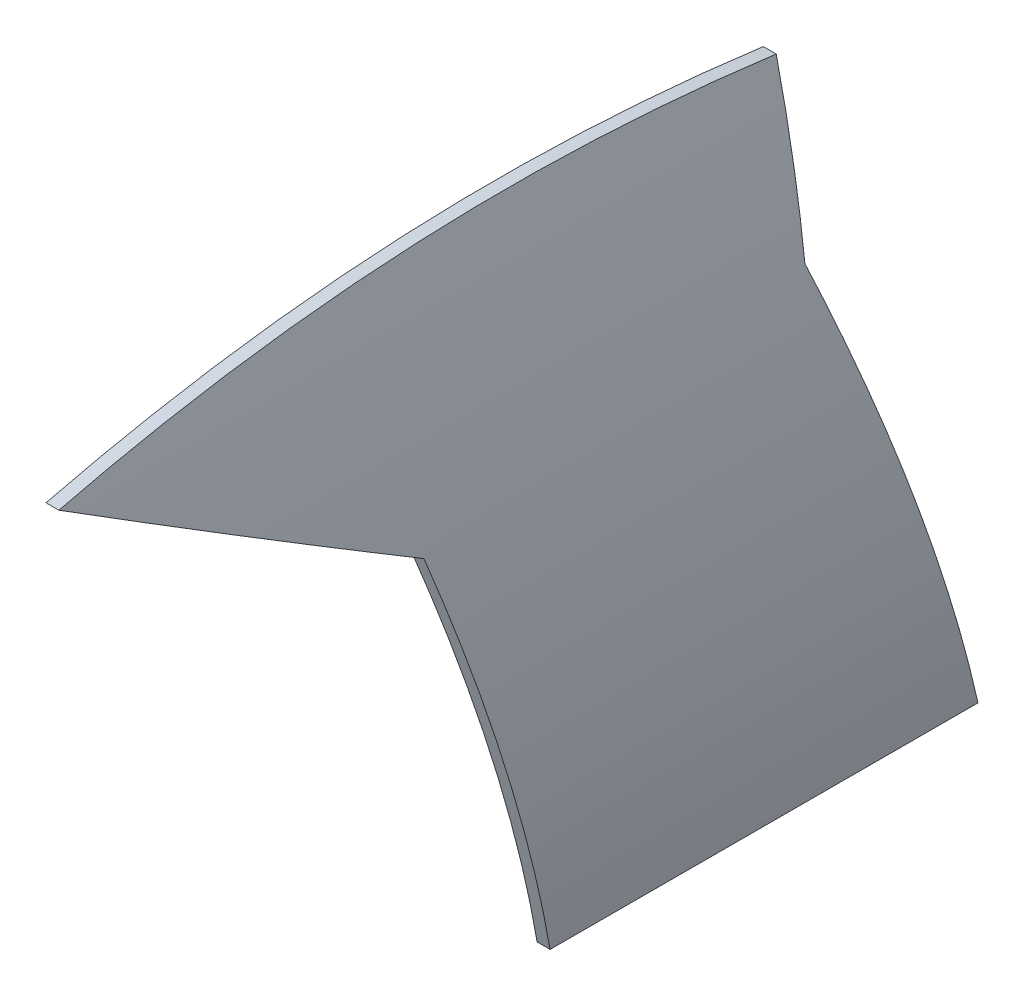
ISO-10303-21;
HEADER;
FILE_DESCRIPTION(('STEP AP214'),'2;1');
FILE_NAME('part.step','',(''),(''),'','','');
FILE_SCHEMA(('AUTOMOTIVE_DESIGN { 1 0 10303 214 1 1 1 1 }'));
ENDSEC;
DATA;
#1=APPLICATION_CONTEXT('core data for automotive mechanical design processes');
#2=APPLICATION_PROTOCOL_DEFINITION('international standard','automotive_design',2000,#1);
#3=PRODUCT_CONTEXT('',#1,'mechanical');
#4=PRODUCT('Part','Part','',(#3));
#5=PRODUCT_RELATED_PRODUCT_CATEGORY('part','',(#4));
#6=PRODUCT_DEFINITION_FORMATION('','',#4);
#7=PRODUCT_DEFINITION_CONTEXT('part definition',#1,'design');
#8=PRODUCT_DEFINITION('design','',#6,#7);
#9=PRODUCT_DEFINITION_SHAPE('','',#8);
#10=(LENGTH_UNIT() NAMED_UNIT(*) SI_UNIT(.MILLI.,.METRE.));
#11=(NAMED_UNIT(*) PLANE_ANGLE_UNIT() SI_UNIT($,.RADIAN.));
#12=(NAMED_UNIT(*) SI_UNIT($,.STERADIAN.) SOLID_ANGLE_UNIT());
#13=UNCERTAINTY_MEASURE_WITH_UNIT(LENGTH_MEASURE(1.E-05),#10,'distance_accuracy_value','');
#14=(GEOMETRIC_REPRESENTATION_CONTEXT(3) GLOBAL_UNCERTAINTY_ASSIGNED_CONTEXT((#13)) GLOBAL_UNIT_ASSIGNED_CONTEXT((#10,
#11,#12)) REPRESENTATION_CONTEXT('',''));
#15=CARTESIAN_POINT('',(0.,0.,0.));
#16=DIRECTION('',(0.,0.,1.));
#17=DIRECTION('',(1.,0.,0.));
#18=AXIS2_PLACEMENT_3D('',#15,#16,#17);
#19=CARTESIAN_POINT('',(424.408763923994,535.98584495263,-1500.));
#20=CARTESIAN_POINT('',(580.279022027442,-69.3133814321735,-1500.));
#21=CARTESIAN_POINT('',(402.972403467795,-683.224116143835,-1500.));
#22=B_SPLINE_CURVE_WITH_KNOTS('',2,(#19,#20,#21),.UNSPECIFIED.,.F.,.F.,(3,3),(0.,1.),.UNSPECIFIED.);
#23=DIRECTION('',(0.,0.,1.));
#24=VECTOR('',#23,1.);
#25=SURFACE_OF_LINEAR_EXTRUSION('',#22,#24);
#26=CARTESIAN_POINT('',(424.408763923994,535.98584495263,-428.349120030013));
#27=CARTESIAN_POINT('',(580.279022027442,-69.3133814321735,-428.349120030013));
#28=CARTESIAN_POINT('',(402.972403467795,-683.224116143835,-428.349120030013));
#29=B_SPLINE_CURVE_WITH_KNOTS('',2,(#26,#27,#28),.UNSPECIFIED.,.F.,.F.,(3,3),(0.,1.),.UNSPECIFIED.);
#30=CARTESIAN_POINT('',(483.593842745896,214.831415583255,-428.349120030013));
#31=VERTEX_POINT('',#30);
#32=CARTESIAN_POINT('',(438.003436023907,480.454128250413,-428.349120030013));
#33=VERTEX_POINT('',#32);
#34=EDGE_CURVE('E118',#31,#33,#29,.F.);
#35=ORIENTED_EDGE('',*,*,#34,.T.);
#36=CARTESIAN_POINT('',(438.003436023766,480.454128251022,-428.349120030013));
#37=CARTESIAN_POINT('',(437.692195512989,481.794967451917,-416.288473386201));
#38=CARTESIAN_POINT('',(437.392825184706,483.079434502654,-404.221246889934));
#39=CARTESIAN_POINT('',(436.818516031521,485.535053758608,-380.074614450257));
#40=CARTESIAN_POINT('',(436.543577358049,486.706205261494,-367.995208431827));
#41=CARTESIAN_POINT('',(436.018825870421,488.934609034484,-343.825316440315));
#42=CARTESIAN_POINT('',(435.769013119235,489.991861019138,-331.734830439541));
#43=CARTESIAN_POINT('',(435.295133177661,491.991931494098,-307.543889107207));
#44=CARTESIAN_POINT('',(435.071065992102,492.93474996294,-295.443433773777));
#45=CARTESIAN_POINT('',(434.649259451483,494.705377358875,-271.234763089152));
#46=CARTESIAN_POINT('',(434.451517692892,495.533196785769,-259.126548547946));
#47=CARTESIAN_POINT('',(434.08283838524,497.073472968752,-234.902388978163));
#48=CARTESIAN_POINT('',(433.911900804925,497.785929859358,-222.786443958616));
#49=CARTESIAN_POINT('',(433.597267430045,499.095068904542,-198.547946928205));
#50=CARTESIAN_POINT('',(433.453571633116,499.691751069166,-186.425394917915));
#51=CARTESIAN_POINT('',(433.19379548125,500.768970877602,-162.1748105472));
#52=CARTESIAN_POINT('',(433.077715181199,501.249508290579,-150.046778175931));
#53=CARTESIAN_POINT('',(432.873474212692,502.094131162167,-125.785793508346));
#54=CARTESIAN_POINT('',(432.785314991954,502.458210582407,-113.652840989565));
#55=CARTESIAN_POINT('',(432.637167760409,503.069599793639,-89.3838165546957));
#56=CARTESIAN_POINT('',(432.577179760872,503.316909537921,-77.2477446373603));
#57=CARTESIAN_POINT('',(432.485552128072,503.694519372388,-52.973719864869));
#58=CARTESIAN_POINT('',(432.453912384939,503.824819916066,-40.8357670171855));
#59=CARTESIAN_POINT('',(432.419090806649,503.968218748881,-16.5592199803324));
#60=CARTESIAN_POINT('',(432.415908755145,503.981317929036,-4.42062579674005));
#61=CARTESIAN_POINT('',(432.438045127301,503.890164845572,19.8570699568527));
#62=CARTESIAN_POINT('',(432.463365836146,503.785903172646,31.9961714894985));
#63=CARTESIAN_POINT('',(432.542485727767,503.459911340544,56.2727299398717));
#64=CARTESIAN_POINT('',(432.596284972401,503.23818092622,68.4101868539695));
#65=CARTESIAN_POINT('',(432.732269481582,502.677191536173,92.6824190947496));
#66=CARTESIAN_POINT('',(432.814455189939,502.337930722913,104.817194376537));
#67=CARTESIAN_POINT('',(433.007052276336,501.541862510793,129.083004647092));
#68=CARTESIAN_POINT('',(433.117464477937,501.085051682187,141.214039516383));
#69=CARTESIAN_POINT('',(433.404819016761,499.894242747243,169.227227563865));
#70=CARTESIAN_POINT('',(433.591775624244,499.11821441931,185.107510507668));
#71=CARTESIAN_POINT('',(434.013036640264,497.36474953956,216.857135051826));
#72=CARTESIAN_POINT('',(434.247343534613,496.387302413533,232.72647603384));
#73=CARTESIAN_POINT('',(434.762419359628,494.23131614054,264.451473166395));
#74=CARTESIAN_POINT('',(435.043190419632,493.052767777524,280.307128656275));
#75=CARTESIAN_POINT('',(435.650112422779,490.49503598336,312.001986555513));
#76=CARTESIAN_POINT('',(435.976265103558,489.115844869628,327.841188311461));
#77=CARTESIAN_POINT('',(436.67267330223,486.157423714589,359.500396147693));
#78=CARTESIAN_POINT('',(437.042930116786,484.578187791873,375.320401649787));
#79=CARTESIAN_POINT('',(437.82607820568,481.220411713878,406.938486226524));
#80=CARTESIAN_POINT('',(438.238970276914,479.441867833283,422.736564885737));
#81=CARTESIAN_POINT('',(439.106069121052,475.684891825077,454.320322415401));
#82=CARTESIAN_POINT('',(439.560307916758,473.706304631452,470.105981958231));
#83=CARTESIAN_POINT('',(440.507983950036,469.551402715587,501.649906067918));
#84=CARTESIAN_POINT('',(441.001420776349,467.375090067813,517.408170920422));
#85=CARTESIAN_POINT('',(442.025472745004,462.825878226712,548.894655639282));
#86=CARTESIAN_POINT('',(442.556086898964,460.452984259315,564.62287629297));
#87=CARTESIAN_POINT('',(443.652298192155,455.511883474365,596.046650496786));
#88=CARTESIAN_POINT('',(444.217893744178,452.943685517109,611.742205495698));
#89=CARTESIAN_POINT('',(445.381716928357,447.613372632912,643.098046794105));
#90=CARTESIAN_POINT('',(445.979942366981,444.85127073751,658.758335390852));
#91=CARTESIAN_POINT('',(447.206474944181,439.134698709008,690.041088512163));
#92=CARTESIAN_POINT('',(447.834779300748,436.180246357396,705.663556394902));
#93=CARTESIAN_POINT('',(448.47688615743,433.130214411635,721.266753533404));
#94=B_SPLINE_CURVE_WITH_KNOTS('',3,(#36,#37,#38,#39,#40,#41,#42,#43,#44,#45,#46,#47,#48,#49,#50,
#51,#52,#53,#54,#55,#56,#57,#58,#59,#60,#61,#62,#63,#64,#65,#66,#67,#68,#69,#70,#71,#72,#73,#74,
#75,#76,#77,#78,#79,#80,#81,#82,#83,#84,#85,#86,#87,#88,#89,#90,#91,#92,#93),.UNSPECIFIED.,.F.,
.F.,(4,2,2,2,2,2,2,2,2,2,2,2,2,2,2,2,2,2,2,2,2,2,2,2,2,2,2,2,4),(0.,36.4166974903907,
72.8336206774067,109.250635128416,145.667656409643,182.081350504934,218.495002140053,
254.908650615213,291.322371461203,327.737980060536,364.153603227002,400.569085256438,
436.984290438651,473.402415387131,509.820619438127,546.239392897835,582.659229065064,
630.358815038332,678.060905812722,725.765183261944,773.471287782206,821.178795209432,
868.887194498413,916.632863277482,964.378031183775,1012.12193023657,1059.86366459667,
1107.60219348391,1155.3363155188),.UNSPECIFIED.);
#95=CARTESIAN_POINT('',(448.47688615743,433.130214411636,721.266753533404));
#96=VERTEX_POINT('',#95);
#97=EDGE_CURVE('E60',#33,#96,#94,.T.);
#98=ORIENTED_EDGE('',*,*,#97,.T.);
#99=CARTESIAN_POINT('',(448.47688615743,433.130214411636,721.266753533404));
#100=CARTESIAN_POINT('',(450.300676691619,424.466841645308,706.415257362557));
#101=CARTESIAN_POINT('',(452.073690968561,415.80075474374,691.55910838844));
#102=CARTESIAN_POINT('',(455.517721550087,398.464970406909,661.840620953873));
#103=CARTESIAN_POINT('',(457.188755671217,389.795273870279,646.978284033935));
#104=CARTESIAN_POINT('',(460.428792368563,372.452268668991,617.247417974585));
#105=CARTESIAN_POINT('',(461.997809226736,363.77896068176,602.378889996474));
#106=CARTESIAN_POINT('',(465.033781540913,346.428731362997,572.635639735737));
#107=CARTESIAN_POINT('',(466.500747728781,337.751810508238,557.760918270436));
#108=CARTESIAN_POINT('',(469.332587825648,320.39435410883,528.005278728594));
#109=CARTESIAN_POINT('',(470.697468903088,311.71381886111,513.124361161074));
#110=CARTESIAN_POINT('',(473.325108151083,294.349132336589,483.356327119038));
#111=CARTESIAN_POINT('',(474.587869914639,285.664981197826,468.469210881158));
#112=CARTESIAN_POINT('',(477.01124030841,268.293057931879,438.688770996679));
#113=CARTESIAN_POINT('',(478.171848903451,259.60528580345,423.795447347943));
#114=CARTESIAN_POINT('',(480.39088158466,242.226123370037,394.002597462093));
#115=CARTESIAN_POINT('',(481.449302090117,233.534732948976,379.103071025988));
#116=CARTESIAN_POINT('',(483.46392772598,216.148333133731,349.297814199852));
#117=CARTESIAN_POINT('',(484.42012568041,207.453323528437,334.39208344792));
#118=CARTESIAN_POINT('',(486.230275628958,190.059684529158,304.574416592014));
#119=CARTESIAN_POINT('',(487.084216845847,181.361054850418,289.662479999888));
#120=CARTESIAN_POINT('',(488.689821699354,163.960174858553,259.832400013834));
#121=CARTESIAN_POINT('',(489.441470952862,155.257924208485,244.914256042289));
#122=CARTESIAN_POINT('',(490.842464122613,137.849801438604,215.07175986535));
#123=CARTESIAN_POINT('',(491.491790047507,129.143928951179,200.147407029764));
#124=CARTESIAN_POINT('',(492.089879173517,120.437162941002,185.221522440889));
#125=B_SPLINE_CURVE_WITH_KNOTS('',3,(#99,#100,#101,#102,#103,#104,#105,#106,#107,#108,#109,#110,
#111,#112,#113,#114,#115,#116,#117,#118,#119,#120,#121,#122,#123,#124),.UNSPECIFIED.,.F.,.F.,(4,
2,2,2,2,2,2,2,2,2,2,2,4),(0.,51.8701924446341,103.731296758899,155.585125049739,
207.433492012824,259.278214746266,311.121112563406,362.964028231335,414.808759836801,
466.657128532731,518.51095692639,570.372068887664,622.242289357004),.UNSPECIFIED.);
#126=CARTESIAN_POINT('',(492.089879173517,120.437162941002,185.221522440889));
#127=VERTEX_POINT('',#126);
#128=EDGE_CURVE('E64',#96,#127,#125,.T.);
#129=ORIENTED_EDGE('',*,*,#128,.T.);
#130=CARTESIAN_POINT('',(492.089879173517,120.437162941002,185.221522440889));
#131=CARTESIAN_POINT('',(492.887576008317,108.825040924121,180.875068863687));
#132=CARTESIAN_POINT('',(493.59435741753,97.2074388762597,176.526564093755));
#133=CARTESIAN_POINT('',(494.82581759418,73.9639251989336,167.826444251517));
#134=CARTESIAN_POINT('',(495.35049874455,62.3380136802003,163.474829220657));
#135=CARTESIAN_POINT('',(496.217503518885,39.0803344067719,154.769407151508));
#136=CARTESIAN_POINT('',(496.559828819398,27.4485667069018,150.415600133739));
#137=CARTESIAN_POINT('',(497.062063272721,4.18163648381267,141.706715405208));
#138=CARTESIAN_POINT('',(497.221973340189,-7.45352602209167,137.351637700927));
#139=CARTESIAN_POINT('',(497.359461729347,-30.724782326233,128.641133706732));
#140=CARTESIAN_POINT('',(497.337040259262,-42.3608761233913,124.285707417222));
#141=CARTESIAN_POINT('',(497.110690767452,-65.571686089367,115.597828676393));
#142=CARTESIAN_POINT('',(496.907696459675,-77.1464102612246,111.265373229511));
#143=CARTESIAN_POINT('',(496.321874735935,-100.291874035615,102.601953772503));
#144=CARTESIAN_POINT('',(495.939047179457,-111.862613635027,98.2709897635453));
#145=CARTESIAN_POINT('',(494.994098840771,-134.997671477961,89.611465279216));
#146=CARTESIAN_POINT('',(494.431977988291,-146.561989718966,85.2829048047871));
#147=CARTESIAN_POINT('',(493.129131984398,-169.681776068601,76.6290964881473));
#148=CARTESIAN_POINT('',(492.388407140618,-181.237244192442,72.3038486402435));
#149=CARTESIAN_POINT('',(490.729190394887,-204.336904527487,63.6575735537906));
#150=CARTESIAN_POINT('',(489.810699580672,-215.881096807254,59.3365462895787));
#151=CARTESIAN_POINT('',(487.775423406808,-239.202266655656,50.6073594997082));
#152=CARTESIAN_POINT('',(486.654823250224,-250.97895228849,46.1993092465325));
#153=CARTESIAN_POINT('',(484.230377649556,-274.515771529412,37.3894042147957));
#154=CARTESIAN_POINT('',(482.926532042575,-286.275905122775,32.9875494417456));
#155=CARTESIAN_POINT('',(480.136909935596,-309.77732883883,24.1908930656336));
#156=CARTESIAN_POINT('',(478.651131867784,-321.518618798252,19.7960915236841));
#157=CARTESIAN_POINT('',(475.499096164043,-344.98007594195,11.0143947605641));
#158=CARTESIAN_POINT('',(473.832836250328,-356.700242857742,6.6274996398879));
#159=CARTESIAN_POINT('',(470.321422825258,-380.117189710088,-2.1375367820138));
#160=CARTESIAN_POINT('',(468.47626709174,-391.813969354293,-6.51567797381228));
#161=CARTESIAN_POINT('',(464.59856884961,-415.243591131398,-15.2854586596807));
#162=CARTESIAN_POINT('',(462.56508703401,-426.976296885453,-19.6770471067221));
#163=CARTESIAN_POINT('',(458.320949918418,-450.413527762545,-28.4496759025062));
#164=CARTESIAN_POINT('',(456.110295091986,-462.11805296082,-32.8307162794101));
#165=CARTESIAN_POINT('',(451.513816982361,-485.496692623682,-41.5814142005175));
#166=CARTESIAN_POINT('',(449.127996553405,-497.170807580582,-45.9510719289946));
#167=CARTESIAN_POINT('',(444.183310995153,-520.486412031024,-54.6781755730083));
#168=CARTESIAN_POINT('',(441.624451951714,-532.127902656999,-59.0356219124177));
#169=CARTESIAN_POINT('',(436.335957845644,-555.376088854112,-67.7374906934213));
#170=CARTESIAN_POINT('',(433.606332975203,-566.98278645863,-72.0819138961158));
#171=CARTESIAN_POINT('',(430.792344124756,-578.571491053465,-76.4196022590295));
#172=B_SPLINE_CURVE_WITH_KNOTS('',3,(#130,#131,#132,#133,#134,#135,#136,#137,#138,#139,#140,
#141,#142,#143,#144,#145,#146,#147,#148,#149,#150,#151,#152,#153,#154,#155,#156,#157,#158,#159,
#160,#161,#162,#163,#164,#165,#166,#167,#168,#169,#170,#171),.UNSPECIFIED.,.F.,.F.,(4,2,2,2,2,2,
2,2,2,2,2,2,2,2,2,2,2,2,2,2,4),(0.,37.2733090335321,74.5461302966621,111.818608873859,
149.090900560219,186.363149681013,223.443782954176,260.524445200686,297.605121980481,
334.685734891645,371.766120916679,409.638144551987,447.510201854108,485.382585543974,
523.255447261122,561.128779478246,599.202386261646,637.275891282729,675.34877605266,
713.420322475861,751.489598755791),.UNSPECIFIED.);
#173=CARTESIAN_POINT('',(430.792344124756,-578.571491053465,-76.4196022590295));
#174=VERTEX_POINT('',#173);
#175=EDGE_CURVE('E160',#127,#174,#172,.T.);
#176=ORIENTED_EDGE('',*,*,#175,.T.);
#177=CARTESIAN_POINT('',(430.792344124756,-578.571491053465,-76.4196022590295));
#178=CARTESIAN_POINT('',(430.754553586614,-578.727122930513,-189.715462215858));
#179=CARTESIAN_POINT('',(430.716747052109,-578.882754807554,-303.011322167346));
#180=CARTESIAN_POINT('',(430.641101990374,-579.194018561622,-529.603042059641));
#181=CARTESIAN_POINT('',(430.603263463145,-579.349650438648,-642.898902000449));
#182=CARTESIAN_POINT('',(430.565408939553,-579.505282315667,-756.194761935916));
#183=B_SPLINE_CURVE_WITH_KNOTS('',3,(#177,#178,#179,#180,#181,#182),.UNSPECIFIED.,.F.,.F.,(4,2,
4),(0.,339.88791946002,679.775838920041),.UNSPECIFIED.);
#184=CARTESIAN_POINT('',(430.565408939553,-579.505282315667,-756.194761935916));
#185=VERTEX_POINT('',#184);
#186=EDGE_CURVE('E165',#174,#185,#183,.T.);
#187=ORIENTED_EDGE('',*,*,#186,.T.);
#188=CARTESIAN_POINT('',(430.565408939553,-579.505282315667,-756.194761935916));
#189=CARTESIAN_POINT('',(433.695426795303,-566.636910787127,-750.883614238451));
#190=CARTESIAN_POINT('',(436.721299975674,-553.746858757861,-745.563518373671));
#191=CARTESIAN_POINT('',(442.562047225671,-527.925037200164,-734.906108630227));
#192=CARTESIAN_POINT('',(445.376906516925,-514.993264815876,-729.568793572869));
#193=CARTESIAN_POINT('',(450.792586179674,-489.09092727529,-718.878152563435));
#194=CARTESIAN_POINT('',(453.393397947963,-476.120360581427,-713.524825976762));
#195=CARTESIAN_POINT('',(458.378164110865,-450.143425250746,-702.803396310019));
#196=CARTESIAN_POINT('',(460.762114670433,-437.137055984972,-697.435292970363));
#197=CARTESIAN_POINT('',(465.310521878822,-411.091529027353,-686.6855535629));
#198=CARTESIAN_POINT('',(467.47497810238,-398.052371272031,-681.303917468895));
#199=CARTESIAN_POINT('',(471.568622699334,-372.029093215408,-670.563360823915));
#200=CARTESIAN_POINT('',(473.499249180951,-359.045166249448,-665.204520068007));
#201=CARTESIAN_POINT('',(477.139241999019,-333.051022958375,-654.47598818021));
#202=CARTESIAN_POINT('',(478.848611564833,-320.040807019778,-649.106297207848));
#203=CARTESIAN_POINT('',(482.044097002988,-293.997139360514,-638.357325186387));
#204=CARTESIAN_POINT('',(483.530215894804,-280.963687956521,-632.978044267988));
#205=CARTESIAN_POINT('',(486.277411860832,-254.876630007766,-622.211163823879));
#206=CARTESIAN_POINT('',(487.538490574806,-241.823023610563,-616.82356435907));
#207=CARTESIAN_POINT('',(489.834027498726,-215.698726137822,-606.041314090455));
#208=CARTESIAN_POINT('',(490.868484936728,-202.628035004241,-600.646663262693));
#209=CARTESIAN_POINT('',(492.57629236564,-178.364053903134,-590.632219160681));
#210=CARTESIAN_POINT('',(493.280229038835,-167.172594475257,-586.013181402888));
#211=CARTESIAN_POINT('',(494.52055271106,-144.781582730259,-576.771765718734));
#212=CARTESIAN_POINT('',(495.056937524328,-133.582030309473,-572.149387749589));
#213=CARTESIAN_POINT('',(495.961538930885,-111.177033056373,-562.902199843287));
#214=CARTESIAN_POINT('',(496.329754135983,-99.9715881761828,-558.277389886371));
#215=CARTESIAN_POINT('',(496.89753083575,-77.5569873796004,-549.026238320974));
#216=CARTESIAN_POINT('',(497.097091454502,-66.3478314442368,-544.399896704663));
#217=CARTESIAN_POINT('',(497.327203832937,-43.9279984331285,-535.146585653579));
#218=CARTESIAN_POINT('',(497.357755020837,-32.717321352366,-530.519616216734));
#219=CARTESIAN_POINT('',(497.249625313087,-10.2966381338409,-521.265954260552));
#220=CARTESIAN_POINT('',(497.110944021812,0.913368002291819,-516.639261741888));
#221=CARTESIAN_POINT('',(496.662761096108,23.4056407552212,-507.356052722197));
#222=CARTESIAN_POINT('',(496.352120533987,34.6878879968683,-502.699544217853));
#223=CARTESIAN_POINT('',(495.559281890108,57.2472275249121,-493.388654807723));
#224=CARTESIAN_POINT('',(495.077083846654,68.524319812459,-488.734273901462));
#225=CARTESIAN_POINT('',(493.941308019,91.0711374496482,-479.428552636473));
#226=CARTESIAN_POINT('',(493.287730081516,102.340862792692,-474.777212280467));
#227=CARTESIAN_POINT('',(491.809509084315,124.870741714975,-465.478482111163));
#228=CARTESIAN_POINT('',(490.984865733064,136.130895277869,-460.831092304611));
#229=CARTESIAN_POINT('',(489.164953089193,158.639431594048,-451.541170843775));
#230=CARTESIAN_POINT('',(488.169683505769,169.88781432724,-446.898639197786));
#231=CARTESIAN_POINT('',(486.009125554087,192.370624742577,-437.619335557451));
#232=CARTESIAN_POINT('',(484.843837118223,203.605052419171,-432.982563565397));
#233=CARTESIAN_POINT('',(483.593842745896,214.831415583255,-428.349120030013));
#234=B_SPLINE_CURVE_WITH_KNOTS('',3,(#188,#189,#190,#191,#192,#193,#194,#195,#196,#197,#198,
#199,#200,#201,#202,#203,#204,#205,#206,#207,#208,#209,#210,#211,#212,#213,#214,#215,#216,#217,
#218,#219,#220,#221,#222,#223,#224,#225,#226,#227,#228,#229,#230,#231,#232,#233),.UNSPECIFIED.,
.F.,.F.,(4,2,2,2,2,2,2,2,2,2,2,2,2,2,2,2,2,2,2,2,2,2,4),(0.,42.8062287043517,85.6154525503193,
128.426396186766,171.238096759198,214.04988027666,256.583321995697,299.11614284653,
341.648388387393,384.18032400317,426.712404493836,463.094221500134,499.476513097846,
535.859105015545,572.241885887128,608.624789846672,645.0077788605,681.634675330462,
718.2615636228,754.888484674606,791.515468147313,828.142514045073,864.769574507407),.UNSPECIFIED.);
#235=EDGE_CURVE('E196',#185,#31,#234,.T.);
#236=ORIENTED_EDGE('',*,*,#235,.T.);
#237=EDGE_LOOP('',(#35,#98,#129,#176,#187,#236));
#238=FACE_BOUND('',#237,.T.);
#239=ADVANCED_FACE('F41',(#238),#25,.F.);
#240=CARTESIAN_POINT('',(1500.,480.454128251022,-428.349120030013));
#241=DIRECTION('',(0.,0.,1.));
#242=DIRECTION('',(1.,0.,0.));
#243=AXIS2_PLACEMENT_3D('',#240,#241,#242);
#244=PLANE('',#243);
#245=ORIENTED_EDGE('',*,*,#34,.F.);
#246=DIRECTION('',(-1.,0.,0.));
#247=VECTOR('',#246,1.);
#248=CARTESIAN_POINT('',(1500.,214.831415583255,-428.349120030013));
#249=LINE('',#248,#247);
#250=CARTESIAN_POINT('',(463.469135644396,214.831415583255,-428.349120030013));
#251=VERTEX_POINT('',#250);
#252=EDGE_CURVE('E52',#31,#251,#249,.T.);
#253=ORIENTED_EDGE('',*,*,#252,.T.);
#254=CARTESIAN_POINT('',(405.040618853097,530.998364976459,-428.349120030013));
#255=CARTESIAN_POINT('',(406.64924054386,524.751519190664,-428.349120030013));
#256=CARTESIAN_POINT('',(409.817907630706,512.236240886698,-428.349120030013));
#257=CARTESIAN_POINT('',(415.934329316679,487.222740061786,-428.349120030013));
#258=CARTESIAN_POINT('',(423.17796267826,455.940151621809,-428.349120030013));
#259=CARTESIAN_POINT('',(431.223606194513,418.390634858821,-428.349120030013));
#260=CARTESIAN_POINT('',(441.090410068267,368.305125046003,-428.349120030013));
#261=CARTESIAN_POINT('',(451.809795678839,305.663556952693,-428.349120030013));
#262=CARTESIAN_POINT('',(462.091676613305,230.435403148491,-428.349120030013));
#263=CARTESIAN_POINT('',(469.792938408512,155.14701278781,-428.349120030013));
#264=CARTESIAN_POINT('',(476.621257213656,54.6790581344018,-428.349120030013));
#265=CARTESIAN_POINT('',(478.707620997031,-71.068183562901,-428.349120030013));
#266=CARTESIAN_POINT('',(472.195347161263,-197.047854413728,-428.349120030013));
#267=CARTESIAN_POINT('',(461.824335644245,-297.980275195886,-428.349120030013));
#268=CARTESIAN_POINT('',(451.46462833248,-373.756029871269,-428.349120030013));
#269=CARTESIAN_POINT('',(438.522460674971,-449.610285886943,-428.349120030013));
#270=CARTESIAN_POINT('',(425.584363343901,-512.88885754197,-428.349120030013));
#271=CARTESIAN_POINT('',(413.941312491673,-563.55304301742,-428.349120030013));
#272=CARTESIAN_POINT('',(404.562942079086,-601.570715398056,-428.349120030013));
#273=CARTESIAN_POINT('',(396.20780122886,-633.272967850054,-428.349120030013));
#274=CARTESIAN_POINT('',(389.202587350749,-658.637357812673,-428.349120030013));
#275=CARTESIAN_POINT('',(385.588019063241,-671.337435384699,-428.349120030013));
#276=CARTESIAN_POINT('',(383.757741212963,-677.674633786648,-428.349120030013));
#277=B_SPLINE_CURVE_WITH_KNOTS('',3,(#254,#255,#256,#257,#258,#259,#260,#261,#262,#263,#264,
#265,#266,#267,#268,#269,#270,#271,#272,#273,#274,#275,#276),.UNSPECIFIED.,.F.,.F.,(4,1,1,1,1,1,
1,1,1,1,1,1,1,1,1,1,1,1,1,1,4),(0.,0.015625,0.03125,0.0625,0.09375,0.125,0.1875,0.25,0.3125,
0.375,0.5,0.625,0.6875,0.75,0.8125,0.875,0.90625,0.9375,0.96875,0.984375,1.),.UNSPECIFIED.);
#278=CARTESIAN_POINT('',(417.46699620603,480.45412824548,-428.349120030013));
#279=VERTEX_POINT('',#278);
#280=EDGE_CURVE('E107',#251,#279,#277,.F.);
#281=ORIENTED_EDGE('',*,*,#280,.T.);
#282=DIRECTION('',(-1.,0.,0.));
#283=VECTOR('',#282,1.);
#284=CARTESIAN_POINT('',(1500.,480.454128251022,-428.349120030013));
#285=LINE('',#284,#283);
#286=EDGE_CURVE('E11',#33,#279,#285,.T.);
#287=ORIENTED_EDGE('',*,*,#286,.F.);
#288=EDGE_LOOP('',(#245,#253,#281,#287));
#289=FACE_BOUND('',#288,.T.);
#290=ADVANCED_FACE('F117',(#289),#244,.F.);
#291=CARTESIAN_POINT('',(1500.,214.831415583255,-428.349120030013));
#292=DIRECTION('',(0.,-0.381511665778787,0.924364024004989));
#293=DIRECTION('',(0.,-0.924364024004989,-0.381511665778787));
#294=AXIS2_PLACEMENT_3D('',#291,#292,#293);
#295=PLANE('',#294);
#296=ORIENTED_EDGE('',*,*,#235,.F.);
#297=DIRECTION('',(-1.,0.,0.));
#298=VECTOR('',#297,1.);
#299=CARTESIAN_POINT('',(1500.,-579.505282315667,-756.194761935916));
#300=LINE('',#299,#298);
#301=CARTESIAN_POINT('',(409.977344733339,-579.505282315667,-756.194761935916));
#302=VERTEX_POINT('',#301);
#303=EDGE_CURVE('E103',#185,#302,#300,.T.);
#304=ORIENTED_EDGE('',*,*,#303,.T.);
#305=CARTESIAN_POINT('',(409.977344733339,-579.505282315667,-756.194761935916));
#306=CARTESIAN_POINT('',(413.132825644516,-566.643120188736,-750.886177037403));
#307=CARTESIAN_POINT('',(416.183528975562,-553.758956668156,-745.568511529818));
#308=CARTESIAN_POINT('',(422.072585205781,-527.948253385828,-734.915690618963));
#309=CARTESIAN_POINT('',(424.910922596542,-515.02171060107,-729.580533968008));
#310=CARTESIAN_POINT('',(430.372104804362,-489.12921028745,-718.893953065576));
#311=CARTESIAN_POINT('',(432.994940585668,-476.163251129514,-713.542528141733));
#312=CARTESIAN_POINT('',(438.022221433196,-450.194951152845,-702.824662534397));
#313=CARTESIAN_POINT('',(440.426662465627,-437.192609666693,-697.45822157544));
#314=CARTESIAN_POINT('',(445.01443573626,-411.154600304579,-686.711584896241));
#315=CARTESIAN_POINT('',(447.197767523034,-398.118932360632,-681.33138914794));
#316=CARTESIAN_POINT('',(451.327123645094,-372.103571162967,-670.594100018755));
#317=CARTESIAN_POINT('',(453.274621852365,-359.1240778431,-665.237089156333));
#318=CARTESIAN_POINT('',(456.946666511601,-333.138363519038,-654.51203614608));
#319=CARTESIAN_POINT('',(458.671216353689,-320.132142924309,-649.143994167247));
#320=CARTESIAN_POINT('',(461.895308776308,-294.096071278489,-638.398157239393));
#321=CARTESIAN_POINT('',(463.394854530165,-281.066220563288,-633.020362429003));
#322=CARTESIAN_POINT('',(466.167093166292,-254.98601368552,-622.256309619286));
#323=CARTESIAN_POINT('',(467.439787776371,-241.935657679898,-616.870051684734));
#324=CARTESIAN_POINT('',(469.756698794643,-215.817555776075,-606.09035850592));
#325=CARTESIAN_POINT('',(470.800914400723,-202.749809816987,-600.696923236528));
#326=CARTESIAN_POINT('',(472.52541160135,-178.486062325885,-590.682575552096));
#327=CARTESIAN_POINT('',(473.236460726175,-167.291920225448,-586.062430578043));
#328=CARTESIAN_POINT('',(474.489435526917,-144.895382816971,-576.818734293365));
#329=CARTESIAN_POINT('',(475.031358908904,-133.692987399053,-572.19518293739));
#330=CARTESIAN_POINT('',(475.945443381526,-111.282185573184,-562.945599316663));
#331=CARTESIAN_POINT('',(476.317603015104,-100.073779114468,-558.319567030959));
#332=CARTESIAN_POINT('',(476.891663774335,-77.6531782189503,-549.065939051855));
#333=CARTESIAN_POINT('',(477.093563980174,-66.4409837620115,-544.438343350143));
#334=CARTESIAN_POINT('',(477.326739321362,-44.0150384201756,-535.182509564057));
#335=CARTESIAN_POINT('',(477.358013856175,-32.8012875299396,-530.554271477479));
#336=CARTESIAN_POINT('',(477.249701573187,-10.3744631673312,-521.298074894194));
#337=CARTESIAN_POINT('',(477.11011433764,0.838610303317716,-516.670116398197));
#338=CARTESIAN_POINT('',(476.658449077852,23.3383175249567,-507.383838959066));
#339=CARTESIAN_POINT('',(476.345200748983,34.6249312192394,-502.725528293911));
#340=CARTESIAN_POINT('',(475.545456397173,57.1929095337675,-493.411073407696));
#341=CARTESIAN_POINT('',(475.058960412899,68.4742741551839,-488.754929186151));
#342=CARTESIAN_POINT('',(473.912911851409,91.0295002725813,-479.445737499112));
#343=CARTESIAN_POINT('',(473.253359110348,102.303361761449,-474.792690036553));
#344=CARTESIAN_POINT('',(471.761521085504,124.841334604242,-465.49061927305));
#345=CARTESIAN_POINT('',(470.929235494669,136.105445940799,-460.841595979274));
#346=CARTESIAN_POINT('',(469.092388748169,158.621677667081,-451.548498400966));
#347=CARTESIAN_POINT('',(468.087827290034,169.873798035717,-446.904424125139));
#348=CARTESIAN_POINT('',(465.907058548999,192.363822462191,-437.622143054556));
#349=CARTESIAN_POINT('',(464.730851204355,203.601726514913,-432.983936261912));
#350=CARTESIAN_POINT('',(463.469135644396,214.831415583255,-428.349120030013));
#351=B_SPLINE_CURVE_WITH_KNOTS('',3,(#305,#306,#307,#308,#309,#310,#311,#312,#313,#314,#315,
#316,#317,#318,#319,#320,#321,#322,#323,#324,#325,#326,#327,#328,#329,#330,#331,#332,#333,#334,
#335,#336,#337,#338,#339,#340,#341,#342,#343,#344,#345,#346,#347,#348,#349,#350),.UNSPECIFIED.,
.F.,.F.,(4,2,2,2,2,2,2,2,2,2,2,2,2,2,2,2,2,2,2,2,2,2,4),(0.,42.8033938866155,85.6099105248063,
128.418221079677,171.227322151142,214.036510622179,256.562593966987,299.088030589501,
341.612867401759,384.13738031005,426.662042504993,463.053774885006,499.446000841235,
535.838539140707,572.231274047062,608.624137041455,645.017089014145,681.658328385867,
718.299559579472,754.94082546367,791.582156482033,828.223551833506,864.864960365451),.UNSPECIFIED.);
#352=EDGE_CURVE('E97',#302,#251,#351,.T.);
#353=ORIENTED_EDGE('',*,*,#352,.T.);
#354=ORIENTED_EDGE('',*,*,#252,.F.);
#355=EDGE_LOOP('',(#296,#304,#353,#354));
#356=FACE_BOUND('',#355,.T.);
#357=ADVANCED_FACE('F100',(#356),#295,.F.);
#358=CARTESIAN_POINT('',(1500.,480.454128251022,-428.349120030013));
#359=CARTESIAN_POINT('',(1500.,544.768334547185,150.150462677054));
#360=CARTESIAN_POINT('',(1500.,433.130214411635,721.266753533403));
#361=B_SPLINE_CURVE_WITH_KNOTS('',2,(#358,#359,#360),.UNSPECIFIED.,.F.,.F.,(3,3),(0.,1.),.UNSPECIFIED.);
#362=DIRECTION('',(-1.,0.,0.));
#363=VECTOR('',#362,1.);
#364=SURFACE_OF_LINEAR_EXTRUSION('',#361,#363);
#365=ORIENTED_EDGE('',*,*,#97,.F.);
#366=ORIENTED_EDGE('',*,*,#286,.T.);
#367=CARTESIAN_POINT('',(417.466996204732,480.454128251022,-428.349120030013));
#368=CARTESIAN_POINT('',(417.152964079381,481.794960744536,-416.288533751063));
#369=CARTESIAN_POINT('',(416.850909059881,483.079422256173,-404.221362187184));
#370=CARTESIAN_POINT('',(416.27145031175,485.53503247371,-380.074828873736));
#371=CARTESIAN_POINT('',(415.994046736836,486.706180473039,-367.995467048628));
#372=CARTESIAN_POINT('',(415.464591222442,488.93457890094,-343.825653522948));
#373=CARTESIAN_POINT('',(415.212539346944,489.991829042057,-331.735201794466));
#374=CARTESIAN_POINT('',(414.73441229044,491.991897146013,-307.544319957489));
#375=CARTESIAN_POINT('',(414.50833711441,492.934715086926,-295.443889847084));
#376=CARTESIAN_POINT('',(414.082750769983,494.705342218409,-271.235264304277));
#377=CARTESIAN_POINT('',(413.883237170132,495.533161936247,-259.127069684741));
#378=CARTESIAN_POINT('',(413.51125422837,497.073439471161,-234.902942745639));
#379=CARTESIAN_POINT('',(413.338784854695,497.785897423734,-222.787010435179));
#380=CARTESIAN_POINT('',(413.021331800592,499.095039114478,-198.548532548544));
#381=CARTESIAN_POINT('',(412.876348117589,499.691722863502,-186.42598697299));
#382=CARTESIAN_POINT('',(412.614243480459,500.768946149221,-162.175410151727));
#383=CARTESIAN_POINT('',(412.497122581676,501.249485455215,-150.04737889517));
#384=CARTESIAN_POINT('',(412.291050479988,502.094112338007,-125.786389419206));
#385=CARTESIAN_POINT('',(412.20210074424,502.458193849675,-113.653430976129));
#386=CARTESIAN_POINT('',(412.052624913136,503.069587178852,-89.3843915109751));
#387=CARTESIAN_POINT('',(411.992098829295,503.316898949055,-77.2483104876346));
#388=CARTESIAN_POINT('',(411.89964910433,503.694512670348,-52.974265526255));
#389=CARTESIAN_POINT('',(411.867725352415,503.824815074669,-40.8363015956914));
#390=CARTESIAN_POINT('',(411.832590847088,503.968217410261,-16.559731626658));
#391=CARTESIAN_POINT('',(411.829379875415,503.981318232434,-4.42112559377054));
#392=CARTESIAN_POINT('',(411.851713885423,503.890168200267,19.856595474864));
#393=CARTESIAN_POINT('',(411.87726117767,503.785907916608,31.9957104731408));
#394=CARTESIAN_POINT('',(411.957089500889,503.459918638532,56.2722941904814));
#395=CARTESIAN_POINT('',(412.011370594265,503.238189388994,68.4097629059126));
#396=CARTESIAN_POINT('',(412.148573186349,502.677202190934,92.6820158864018));
#397=CARTESIAN_POINT('',(412.231495132815,502.337942404991,104.816800106524));
#398=CARTESIAN_POINT('',(412.425817570861,501.541876244938,129.08262417817));
#399=CARTESIAN_POINT('',(412.537218893288,501.085066441465,141.213663910115));
#400=CARTESIAN_POINT('',(412.827148656416,499.894255784341,169.226958068879));
#401=CARTESIAN_POINT('',(413.015781366441,499.118223490353,185.107340379628));
#402=CARTESIAN_POINT('',(413.44081914069,497.364748885135,216.857152782238));
#403=CARTESIAN_POINT('',(413.67722671471,496.387295992464,232.726582254737));
#404=CARTESIAN_POINT('',(414.196920845149,494.231296962538,264.451743631135));
#405=CARTESIAN_POINT('',(414.480209552808,493.052741597197,280.307474872884));
#406=CARTESIAN_POINT('',(415.092574803361,490.494995234973,312.002469703596));
#407=CARTESIAN_POINT('',(415.421653102908,489.115796540609,327.84173263728));
#408=CARTESIAN_POINT('',(416.124309448364,486.15736040459,359.501046512316));
#409=CARTESIAN_POINT('',(416.497888806023,484.578117066178,375.321096873452));
#410=CARTESIAN_POINT('',(417.288066276945,481.220327159754,406.939253174218));
#411=CARTESIAN_POINT('',(417.704665197088,479.44177685347,422.737358696615));
#412=CARTESIAN_POINT('',(418.579550841392,475.684789335813,454.32115501622));
#413=CARTESIAN_POINT('',(419.037869891171,473.706196994097,470.106826461815));
#414=CARTESIAN_POINT('',(419.994060750477,469.551287539846,501.650753155254));
#415=CARTESIAN_POINT('',(420.491932144573,467.374972504029,517.409008689281));
#416=CARTESIAN_POINT('',(421.525189386284,462.825759649369,548.895452274736));
#417=CARTESIAN_POINT('',(422.060574234122,460.452867069242,564.623641116009));
#418=CARTESIAN_POINT('',(423.166642214235,455.511773858724,596.047328083172));
#419=CARTESIAN_POINT('',(423.73732374015,452.943582115221,611.742827663201));
#420=CARTESIAN_POINT('',(424.911612518358,447.613287539317,643.098533462048));
#421=CARTESIAN_POINT('',(425.515217549881,444.851197782208,658.758741987314));
#422=CARTESIAN_POINT('',(426.752780311231,439.134656993136,690.041309429242));
#423=CARTESIAN_POINT('',(427.386735223748,436.180223806849,705.663671718186));
#424=CARTESIAN_POINT('',(428.034617282676,433.130214411635,721.266753533403));
#425=B_SPLINE_CURVE_WITH_KNOTS('',3,(#367,#368,#369,#370,#371,#372,#373,#374,#375,#376,#377,
#378,#379,#380,#381,#382,#383,#384,#385,#386,#387,#388,#389,#390,#391,#392,#393,#394,#395,#396,
#397,#398,#399,#400,#401,#402,#403,#404,#405,#406,#407,#408,#409,#410,#411,#412,#413,#414,#415,
#416,#417,#418,#419,#420,#421,#422,#423,#424),.UNSPECIFIED.,.F.,.F.,(4,2,2,2,2,2,2,2,2,2,2,2,2,
2,2,2,2,2,2,2,2,2,2,2,2,2,2,2,4),(0.,36.4167309747178,72.8336890126,109.250738957002,
145.667795879339,182.081516879868,218.495195111001,254.908869928499,291.322617075019,
327.738260343481,364.153918365163,400.569435331542,436.984675486273,473.402841613376,
509.821086834046,546.239901427146,582.659778610294,630.359720905001,678.062169710461,
725.766808050347,773.473277013917,821.181152558286,868.88992307822,916.6359792036,
964.381533901852,1012.12581660856,1059.86792805932,1107.60682316206,1155.34129533204),.UNSPECIFIED.);
#426=CARTESIAN_POINT('',(428.034617282676,433.130214411636,721.266753533404));
#427=VERTEX_POINT('',#426);
#428=EDGE_CURVE('E112',#279,#427,#425,.T.);
#429=ORIENTED_EDGE('',*,*,#428,.T.);
#430=DIRECTION('',(-1.,0.,0.));
#431=VECTOR('',#430,1.);
#432=CARTESIAN_POINT('',(1500.,433.130214411635,721.266753533403));
#433=LINE('',#432,#431);
#434=EDGE_CURVE('E155',#96,#427,#433,.T.);
#435=ORIENTED_EDGE('',*,*,#434,.F.);
#436=EDGE_LOOP('',(#365,#366,#429,#435));
#437=FACE_BOUND('',#436,.T.);
#438=ADVANCED_FACE('F134',(#437),#364,.F.);
#439=CARTESIAN_POINT('',(1500.,-579.505282315667,-756.194761935916));
#440=DIRECTION('',(0.,0.99999905650757,-0.00137367535115668));
#441=DIRECTION('',(0.,0.00137367535115668,0.99999905650757));
#442=AXIS2_PLACEMENT_3D('',#439,#440,#441);
#443=PLANE('',#442);
#444=ORIENTED_EDGE('',*,*,#186,.F.);
#445=DIRECTION('',(-1.,0.,0.));
#446=VECTOR('',#445,1.);
#447=CARTESIAN_POINT('',(1500.,-578.571491053465,-76.4196022590295));
#448=LINE('',#447,#446);
#449=CARTESIAN_POINT('',(410.206237060969,-578.571491053465,-76.4196022590295));
#450=VERTEX_POINT('',#449);
#451=EDGE_CURVE('E120',#174,#450,#448,.T.);
#452=ORIENTED_EDGE('',*,*,#451,.T.);
#453=CARTESIAN_POINT('',(410.206237060969,-578.571491053465,-76.4196022590295));
#454=CARTESIAN_POINT('',(410.16812059026,-578.727122930514,-189.715462216037));
#455=CARTESIAN_POINT('',(410.129987994269,-578.882754807555,-303.011322167614));
#456=CARTESIAN_POINT('',(410.053690551726,-579.194018561622,-529.60304205991));
#457=CARTESIAN_POINT('',(410.015525705173,-579.349650438648,-642.898902000628));
#458=CARTESIAN_POINT('',(409.977344733339,-579.505282315667,-756.194761935916));
#459=B_SPLINE_CURVE_WITH_KNOTS('',3,(#453,#454,#455,#456,#457,#458),.UNSPECIFIED.,.F.,.F.,(4,2,
4),(0.,339.887919788114,679.775839576227),.UNSPECIFIED.);
#460=EDGE_CURVE('E106',#450,#302,#459,.T.);
#461=ORIENTED_EDGE('',*,*,#460,.T.);
#462=ORIENTED_EDGE('',*,*,#303,.F.);
#463=EDGE_LOOP('',(#444,#452,#461,#462));
#464=FACE_BOUND('',#463,.T.);
#465=ADVANCED_FACE('F138',(#464),#443,.F.);
#466=CARTESIAN_POINT('',(1500.,-578.571491053465,-76.4196022590295));
#467=DIRECTION('',(0.,0.350551187692572,-0.936543573362888));
#468=DIRECTION('',(0.,0.936543573362888,0.350551187692572));
#469=AXIS2_PLACEMENT_3D('',#466,#467,#468);
#470=PLANE('',#469);
#471=ORIENTED_EDGE('',*,*,#175,.F.);
#472=DIRECTION('',(-1.,0.,0.));
#473=VECTOR('',#472,1.);
#474=CARTESIAN_POINT('',(1500.,120.437162941002,185.221522440889));
#475=LINE('',#474,#473);
#476=CARTESIAN_POINT('',(472.042319007624,120.437162941002,185.221522440889));
#477=VERTEX_POINT('',#476);
#478=EDGE_CURVE('E208',#127,#477,#475,.T.);
#479=ORIENTED_EDGE('',*,*,#478,.T.);
#480=CARTESIAN_POINT('',(472.042319007624,120.437162941002,185.221522440889));
#481=CARTESIAN_POINT('',(472.847209547008,108.825757864297,180.875337216636));
#482=CARTESIAN_POINT('',(473.560377905767,97.2087737862003,176.527063754719));
#483=CARTESIAN_POINT('',(474.802984238738,73.9663485321239,167.827351312707));
#484=CARTESIAN_POINT('',(475.332424708342,62.3409074731559,163.475912376408));
#485=CARTESIAN_POINT('',(476.207306939076,39.0840647312487,154.770803423623));
#486=CARTESIAN_POINT('',(476.552750458609,27.4526631063362,150.417133428855));
#487=CARTESIAN_POINT('',(477.059572961959,4.18640419346098,141.708499973836));
#488=CARTESIAN_POINT('',(477.220952905123,-7.4484530761746,137.353536520444));
#489=CARTESIAN_POINT('',(477.359734865895,-30.7191159547481,128.643254647295));
#490=CARTESIAN_POINT('',(477.337137100694,-42.3549215625503,124.287936227962));
#491=CARTESIAN_POINT('',(477.108817287743,-65.5641111696902,115.600663992512));
#492=CARTESIAN_POINT('',(476.90405331245,-77.1375034533502,111.268707075546));
#493=CARTESIAN_POINT('',(476.313120000127,-100.280233231871,102.60631096174));
#494=CARTESIAN_POINT('',(475.926950516039,-111.849570723438,98.2758717661326));
#495=CARTESIAN_POINT('',(474.973756758484,-134.981711009551,89.6174393324437));
#496=CARTESIAN_POINT('',(474.406732413331,-146.544513801506,85.2894460953324));
#497=CARTESIAN_POINT('',(473.092539115231,-169.661113286646,76.6368306320371));
#498=CARTESIAN_POINT('',(472.345370487183,-181.214909996038,72.3122083997874));
#499=CARTESIAN_POINT('',(470.671755444859,-204.311029229849,63.6672587585981));
#500=CARTESIAN_POINT('',(469.745310175569,-215.853351827076,59.3469313224061));
#501=CARTESIAN_POINT('',(467.692079762783,-239.174874724362,50.6176123852346));
#502=CARTESIAN_POINT('',(466.561379035446,-250.953772737626,46.2087340311469));
#503=CARTESIAN_POINT('',(464.115091035821,-274.494720942329,37.3972835153575));
#504=CARTESIAN_POINT('',(462.799503594707,-286.256771118372,32.9947113594179));
#505=CARTESIAN_POINT('',(459.984800500127,-309.761696846133,24.1967441693747));
#506=CARTESIAN_POINT('',(458.485683199791,-321.504572224832,19.8013492000328));
#507=CARTESIAN_POINT('',(455.305417192849,-344.968833921013,11.01860268415));
#508=CARTESIAN_POINT('',(453.624266092839,-356.690219953888,6.63125124413792));
#509=CARTESIAN_POINT('',(450.081571824819,-380.109204656628,-2.13454795153781));
#510=CARTESIAN_POINT('',(448.220026322582,-391.80680301669,-6.51299559124147));
#511=CARTESIAN_POINT('',(444.307834095632,-415.238711178294,-15.2836320779763));
#512=CARTESIAN_POINT('',(442.256223761836,-426.97287984107,-19.6757680963258));
#513=CARTESIAN_POINT('',(437.97439954642,-450.412558713465,-28.4493131844055));
#514=CARTESIAN_POINT('',(435.744186163381,-462.118069002992,-32.8307222840454));
#515=CARTESIAN_POINT('',(431.107221610647,-485.498167613434,-41.5819662937933));
#516=CARTESIAN_POINT('',(428.700473441683,-497.172756456457,-45.951801399328));
#517=CARTESIAN_POINT('',(423.712626664649,-520.488764355769,-54.6790560555151));
#518=CARTESIAN_POINT('',(421.131534449675,-532.130184612035,-59.0364760553224));
#519=CARTESIAN_POINT('',(415.797347730647,-555.377656662027,-67.7380775288257));
#520=CARTESIAN_POINT('',(413.04426392845,-566.98371060932,-72.0822598086084));
#521=CARTESIAN_POINT('',(410.206237060969,-578.571491053465,-76.4196022590295));
#522=B_SPLINE_CURVE_WITH_KNOTS('',3,(#480,#481,#482,#483,#484,#485,#486,#487,#488,#489,#490,
#491,#492,#493,#494,#495,#496,#497,#498,#499,#500,#501,#502,#503,#504,#505,#506,#507,#508,#509,
#510,#511,#512,#513,#514,#515,#516,#517,#518,#519,#520,#521),.UNSPECIFIED.,.F.,.F.,(4,2,2,2,2,2,
2,2,2,2,2,2,2,2,2,2,2,2,2,2,4),(0.,37.2724034030333,74.5443005521893,111.815841498466,
149.087188182974,186.358490867734,223.434922703955,260.511384596149,297.587861184155,
334.664270903393,371.740443834555,409.622203082292,447.503996921167,485.386130709706,
523.268762637729,561.151884816017,599.238846384528,637.325701634826,675.411909636303,
713.49672179547,751.579166553358),.UNSPECIFIED.);
#523=EDGE_CURVE('E179',#477,#450,#522,.T.);
#524=ORIENTED_EDGE('',*,*,#523,.T.);
#525=ORIENTED_EDGE('',*,*,#451,.F.);
#526=EDGE_LOOP('',(#471,#479,#524,#525));
#527=FACE_BOUND('',#526,.T.);
#528=ADVANCED_FACE('F171',(#527),#470,.F.);
#529=CARTESIAN_POINT('',(1500.,120.437162941002,185.221522440889));
#530=DIRECTION('',(0.,0.863778900898433,-0.503871025524086));
#531=DIRECTION('',(0.,0.503871025524086,0.863778900898434));
#532=AXIS2_PLACEMENT_3D('',#529,#530,#531);
#533=PLANE('',#532);
#534=ORIENTED_EDGE('',*,*,#128,.F.);
#535=ORIENTED_EDGE('',*,*,#434,.T.);
#536=CARTESIAN_POINT('',(428.034617282676,433.130214411636,721.266753533404));
#537=CARTESIAN_POINT('',(429.874736299369,424.467244122066,706.415947322713));
#538=CARTESIAN_POINT('',(431.663652662372,415.801512235736,691.560406946147));
#539=CARTESIAN_POINT('',(435.138613167342,398.466374315898,661.843027654996));
#540=CARTESIAN_POINT('',(436.82467559435,389.796969212968,646.981190335688));
#541=CARTESIAN_POINT('',(440.093884180399,372.454482760701,617.251213560373));
#542=CARTESIAN_POINT('',(441.677045000433,363.781402113052,602.383075307261));
#543=CARTESIAN_POINT('',(444.740412364731,346.431562992073,572.640493957011));
#544=CARTESIAN_POINT('',(446.220629927885,337.754805012696,557.766051706651));
#545=CARTESIAN_POINT('',(449.078074736119,320.397609642808,528.010859643985));
#546=CARTESIAN_POINT('',(450.455309342685,311.717172559983,513.130110359143));
#547=CARTESIAN_POINT('',(453.106753627665,294.352617448858,483.362301597214));
#548=CARTESIAN_POINT('',(454.380966996829,285.668499563637,468.475242365407));
#549=CARTESIAN_POINT('',(456.82633191002,268.296576975687,438.694803643206));
#550=CARTESIAN_POINT('',(457.997483412537,259.608772271474,423.80142415027));
#551=CARTESIAN_POINT('',(460.23668803421,242.229479337381,394.008350548968));
#552=CARTESIAN_POINT('',(461.304737477507,233.537990987257,379.10865623447));
#553=CARTESIAN_POINT('',(463.337702628425,216.15132983822,349.302951407548));
#554=CARTESIAN_POINT('',(464.302610967328,207.456156820557,334.396940520126));
#555=CARTESIAN_POINT('',(466.129257605492,190.062125361281,304.578600875653));
#556=CARTESIAN_POINT('',(466.990984836087,181.363266624555,289.666271612694));
#557=CARTESIAN_POINT('',(468.611234048649,163.961862779196,259.835293592078));
#558=CARTESIAN_POINT('',(469.369741256726,155.259317321319,244.916644235719));
#559=CARTESIAN_POINT('',(470.783519530976,137.850539108613,215.073024442508));
#560=CARTESIAN_POINT('',(471.43877211516,129.144305972715,200.148053352397));
#561=CARTESIAN_POINT('',(472.042319007624,120.437162941002,185.221522440889));
#562=B_SPLINE_CURVE_WITH_KNOTS('',3,(#536,#537,#538,#539,#540,#541,#542,#543,#544,#545,#546,
#547,#548,#549,#550,#551,#552,#553,#554,#555,#556,#557,#558,#559,#560,#561),.UNSPECIFIED.,.F.,
.F.,(4,2,2,2,2,2,2,2,2,2,2,2,4),(0.,51.8729985298211,103.736748207818,155.593092283007,
207.443877163785,259.290952066759,311.136168716826,362.981406247698,414.828491514504,
466.679278424666,518.535622609408,570.399381206989,622.272412602354),.UNSPECIFIED.);
#563=EDGE_CURVE('E184',#427,#477,#562,.T.);
#564=ORIENTED_EDGE('',*,*,#563,.T.);
#565=ORIENTED_EDGE('',*,*,#478,.F.);
#566=EDGE_LOOP('',(#534,#535,#564,#565));
#567=FACE_BOUND('',#566,.T.);
#568=ADVANCED_FACE('F140',(#567),#533,.F.);
#569=CARTESIAN_POINT('',(405.040618853097,530.998364976459,-1500.));
#570=CARTESIAN_POINT('',(406.64924054386,524.751519190664,-1500.));
#571=CARTESIAN_POINT('',(409.817907630706,512.236240886698,-1500.));
#572=CARTESIAN_POINT('',(415.934329316679,487.222740061786,-1500.));
#573=CARTESIAN_POINT('',(423.17796267826,455.940151621809,-1500.));
#574=CARTESIAN_POINT('',(431.223606194513,418.390634858821,-1500.));
#575=CARTESIAN_POINT('',(441.090410068267,368.305125046003,-1500.));
#576=CARTESIAN_POINT('',(451.809795678839,305.663556952693,-1500.));
#577=CARTESIAN_POINT('',(462.091676613305,230.435403148491,-1500.));
#578=CARTESIAN_POINT('',(469.792938408512,155.14701278781,-1500.));
#579=CARTESIAN_POINT('',(476.621257213656,54.6790581344018,-1500.));
#580=CARTESIAN_POINT('',(478.707620997031,-71.068183562901,-1500.));
#581=CARTESIAN_POINT('',(472.195347161263,-197.047854413728,-1500.));
#582=CARTESIAN_POINT('',(461.824335644245,-297.980275195886,-1500.));
#583=CARTESIAN_POINT('',(451.46462833248,-373.756029871269,-1500.));
#584=CARTESIAN_POINT('',(438.522460674971,-449.610285886943,-1500.));
#585=CARTESIAN_POINT('',(425.584363343901,-512.88885754197,-1500.));
#586=CARTESIAN_POINT('',(413.941312491673,-563.55304301742,-1500.));
#587=CARTESIAN_POINT('',(404.562942079086,-601.570715398056,-1500.));
#588=CARTESIAN_POINT('',(396.20780122886,-633.272967850054,-1500.));
#589=CARTESIAN_POINT('',(389.202587350749,-658.637357812673,-1500.));
#590=CARTESIAN_POINT('',(385.588019063241,-671.337435384699,-1500.));
#591=CARTESIAN_POINT('',(383.757741212963,-677.674633786648,-1500.));
#592=B_SPLINE_CURVE_WITH_KNOTS('',3,(#569,#570,#571,#572,#573,#574,#575,#576,#577,#578,#579,
#580,#581,#582,#583,#584,#585,#586,#587,#588,#589,#590,#591),.UNSPECIFIED.,.F.,.F.,(4,1,1,1,1,1,
1,1,1,1,1,1,1,1,1,1,1,1,1,1,4),(0.,0.015625,0.03125,0.0625,0.09375,0.125,0.1875,0.25,0.3125,
0.375,0.5,0.625,0.6875,0.75,0.8125,0.875,0.90625,0.9375,0.96875,0.984375,1.),.UNSPECIFIED.);
#593=DIRECTION('',(0.,0.,1.));
#594=VECTOR('',#593,1.);
#595=SURFACE_OF_LINEAR_EXTRUSION('',#592,#594);
#596=ORIENTED_EDGE('',*,*,#428,.F.);
#597=ORIENTED_EDGE('',*,*,#280,.F.);
#598=ORIENTED_EDGE('',*,*,#352,.F.);
#599=ORIENTED_EDGE('',*,*,#460,.F.);
#600=ORIENTED_EDGE('',*,*,#523,.F.);
#601=ORIENTED_EDGE('',*,*,#563,.F.);
#602=EDGE_LOOP('',(#596,#597,#598,#599,#600,#601));
#603=FACE_BOUND('',#602,.T.);
#604=ADVANCED_FACE('F110',(#603),#595,.T.);
#605=CLOSED_SHELL('',(#239,#290,#357,#438,#465,#528,#568,#604));
#606=MANIFOLD_SOLID_BREP('B2',#605);
#607=ADVANCED_BREP_SHAPE_REPRESENTATION('',(#18,#606),#14);
#608=SHAPE_DEFINITION_REPRESENTATION(#9,#607);
ENDSEC;
END-ISO-10303-21;
